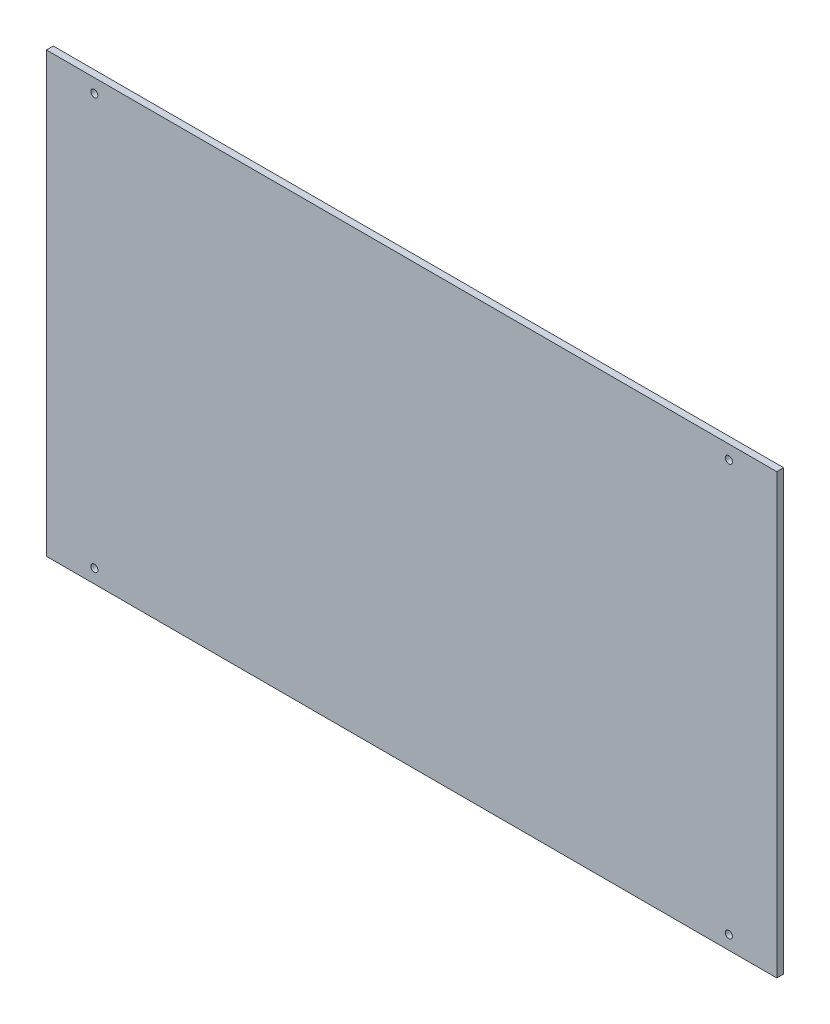
ISO-10303-21;
HEADER;
FILE_DESCRIPTION(('STEP AP214'),'2;1');
FILE_NAME('part.step','',(''),(''),'','','');
FILE_SCHEMA(('AUTOMOTIVE_DESIGN { 1 0 10303 214 1 1 1 1 }'));
ENDSEC;
DATA;
#1=APPLICATION_CONTEXT('core data for automotive mechanical design processes');
#2=APPLICATION_PROTOCOL_DEFINITION('international standard','automotive_design',2000,#1);
#3=PRODUCT_CONTEXT('',#1,'mechanical');
#4=PRODUCT('Part','Part','',(#3));
#5=PRODUCT_RELATED_PRODUCT_CATEGORY('part','',(#4));
#6=PRODUCT_DEFINITION_FORMATION('','',#4);
#7=PRODUCT_DEFINITION_CONTEXT('part definition',#1,'design');
#8=PRODUCT_DEFINITION('design','',#6,#7);
#9=PRODUCT_DEFINITION_SHAPE('','',#8);
#10=(LENGTH_UNIT() NAMED_UNIT(*) SI_UNIT(.MILLI.,.METRE.));
#11=(NAMED_UNIT(*) PLANE_ANGLE_UNIT() SI_UNIT($,.RADIAN.));
#12=(NAMED_UNIT(*) SI_UNIT($,.STERADIAN.) SOLID_ANGLE_UNIT());
#13=UNCERTAINTY_MEASURE_WITH_UNIT(LENGTH_MEASURE(1.E-05),#10,'distance_accuracy_value','');
#14=(GEOMETRIC_REPRESENTATION_CONTEXT(3) GLOBAL_UNCERTAINTY_ASSIGNED_CONTEXT((#13)) GLOBAL_UNIT_ASSIGNED_CONTEXT((#10,
#11,#12)) REPRESENTATION_CONTEXT('',''));
#15=CARTESIAN_POINT('',(0.,0.,0.));
#16=DIRECTION('',(0.,0.,1.));
#17=DIRECTION('',(1.,0.,0.));
#18=AXIS2_PLACEMENT_3D('',#15,#16,#17);
#19=CARTESIAN_POINT('',(0.,0.,5.));
#20=DIRECTION('',(0.,0.,-1.));
#21=DIRECTION('',(-1.,0.,0.));
#22=AXIS2_PLACEMENT_3D('',#19,#20,#21);
#23=PLANE('',#22);
#24=DIRECTION('',(1.,0.,0.));
#25=VECTOR('',#24,1.);
#26=CARTESIAN_POINT('',(533.,0.,5.));
#27=LINE('',#26,#25);
#28=CARTESIAN_POINT('',(0.,0.,5.));
#29=VERTEX_POINT('',#28);
#30=CARTESIAN_POINT('',(533.,0.,5.));
#31=VERTEX_POINT('',#30);
#32=EDGE_CURVE('E87',#29,#31,#27,.T.);
#33=ORIENTED_EDGE('',*,*,#32,.T.);
#34=DIRECTION('',(0.,1.,0.));
#35=VECTOR('',#34,1.);
#36=CARTESIAN_POINT('',(533.,320.,5.));
#37=LINE('',#36,#35);
#38=CARTESIAN_POINT('',(533.,320.,5.));
#39=VERTEX_POINT('',#38);
#40=EDGE_CURVE('E82',#31,#39,#37,.T.);
#41=ORIENTED_EDGE('',*,*,#40,.T.);
#42=DIRECTION('',(-1.,0.,0.));
#43=VECTOR('',#42,1.);
#44=CARTESIAN_POINT('',(0.,320.,5.));
#45=LINE('',#44,#43);
#46=CARTESIAN_POINT('',(0.,320.,5.));
#47=VERTEX_POINT('',#46);
#48=EDGE_CURVE('E85',#39,#47,#45,.T.);
#49=ORIENTED_EDGE('',*,*,#48,.T.);
#50=DIRECTION('',(0.,-1.,0.));
#51=VECTOR('',#50,1.);
#52=CARTESIAN_POINT('',(0.,0.,5.));
#53=LINE('',#52,#51);
#54=EDGE_CURVE('E52',#47,#29,#53,.T.);
#55=ORIENTED_EDGE('',*,*,#54,.T.);
#56=EDGE_LOOP('',(#33,#41,#49,#55));
#57=FACE_BOUND('',#56,.T.);
#58=CARTESIAN_POINT('',(35.,310.,5.));
#59=DIRECTION('',(0.,0.,1.));
#60=DIRECTION('',(1.,0.,0.));
#61=AXIS2_PLACEMENT_3D('',#58,#59,#60);
#62=CIRCLE('',#61,2.59999999999999);
#63=CARTESIAN_POINT('',(37.6,310.,5.));
#64=VERTEX_POINT('',#63);
#65=EDGE_CURVE('E102',#64,#64,#62,.T.);
#66=ORIENTED_EDGE('',*,*,#65,.F.);
#67=EDGE_LOOP('',(#66));
#68=FACE_BOUND('',#67,.T.);
#69=CARTESIAN_POINT('',(498.,310.,5.));
#70=DIRECTION('',(0.,0.,1.));
#71=DIRECTION('',(1.,0.,0.));
#72=AXIS2_PLACEMENT_3D('',#69,#70,#71);
#73=CIRCLE('',#72,2.60000000000007);
#74=CARTESIAN_POINT('',(500.6,310.,5.));
#75=VERTEX_POINT('',#74);
#76=EDGE_CURVE('E117',#75,#75,#73,.T.);
#77=ORIENTED_EDGE('',*,*,#76,.F.);
#78=EDGE_LOOP('',(#77));
#79=FACE_BOUND('',#78,.T.);
#80=CARTESIAN_POINT('',(498.000000000003,9.99999999999999,5.));
#81=DIRECTION('',(0.,0.,1.));
#82=DIRECTION('',(1.,0.,0.));
#83=AXIS2_PLACEMENT_3D('',#80,#81,#82);
#84=CIRCLE('',#83,2.60000000000002);
#85=CARTESIAN_POINT('',(500.600000000003,9.99999999999999,5.));
#86=VERTEX_POINT('',#85);
#87=EDGE_CURVE('E123',#86,#86,#84,.T.);
#88=ORIENTED_EDGE('',*,*,#87,.F.);
#89=EDGE_LOOP('',(#88));
#90=FACE_BOUND('',#89,.T.);
#91=CARTESIAN_POINT('',(35.0000000000031,10.,5.));
#92=DIRECTION('',(0.,0.,1.));
#93=DIRECTION('',(1.,0.,0.));
#94=AXIS2_PLACEMENT_3D('',#91,#92,#93);
#95=CIRCLE('',#94,2.6);
#96=CARTESIAN_POINT('',(37.6000000000031,10.,5.));
#97=VERTEX_POINT('',#96);
#98=EDGE_CURVE('E129',#97,#97,#95,.T.);
#99=ORIENTED_EDGE('',*,*,#98,.F.);
#100=EDGE_LOOP('',(#99));
#101=FACE_BOUND('',#100,.T.);
#102=ADVANCED_FACE('F35',(#57,#68,#79,#90,#101),#23,.F.);
#103=CARTESIAN_POINT('',(0.,0.,0.));
#104=DIRECTION('',(0.,0.,-1.));
#105=DIRECTION('',(-1.,0.,0.));
#106=AXIS2_PLACEMENT_3D('',#103,#104,#105);
#107=PLANE('',#106);
#108=CARTESIAN_POINT('',(498.000000000003,9.99999999999999,0.));
#109=DIRECTION('',(0.,0.,1.));
#110=DIRECTION('',(1.,0.,0.));
#111=AXIS2_PLACEMENT_3D('',#108,#109,#110);
#112=CIRCLE('',#111,2.60000000000002);
#113=CARTESIAN_POINT('',(500.600000000003,9.99999999999999,0.));
#114=VERTEX_POINT('',#113);
#115=EDGE_CURVE('E126',#114,#114,#112,.T.);
#116=ORIENTED_EDGE('',*,*,#115,.T.);
#117=EDGE_LOOP('',(#116));
#118=FACE_BOUND('',#117,.T.);
#119=CARTESIAN_POINT('',(35.,310.,0.));
#120=DIRECTION('',(0.,0.,1.));
#121=DIRECTION('',(1.,0.,0.));
#122=AXIS2_PLACEMENT_3D('',#119,#120,#121);
#123=CIRCLE('',#122,2.59999999999999);
#124=CARTESIAN_POINT('',(37.6,310.,0.));
#125=VERTEX_POINT('',#124);
#126=EDGE_CURVE('E114',#125,#125,#123,.T.);
#127=ORIENTED_EDGE('',*,*,#126,.T.);
#128=EDGE_LOOP('',(#127));
#129=FACE_BOUND('',#128,.T.);
#130=DIRECTION('',(1.,0.,0.));
#131=VECTOR('',#130,1.);
#132=CARTESIAN_POINT('',(533.,0.,0.));
#133=LINE('',#132,#131);
#134=CARTESIAN_POINT('',(0.,0.,0.));
#135=VERTEX_POINT('',#134);
#136=CARTESIAN_POINT('',(533.,0.,0.));
#137=VERTEX_POINT('',#136);
#138=EDGE_CURVE('E99',#135,#137,#133,.T.);
#139=ORIENTED_EDGE('',*,*,#138,.F.);
#140=DIRECTION('',(0.,-1.,0.));
#141=VECTOR('',#140,1.);
#142=CARTESIAN_POINT('',(0.,0.,0.));
#143=LINE('',#142,#141);
#144=CARTESIAN_POINT('',(0.,320.,0.));
#145=VERTEX_POINT('',#144);
#146=EDGE_CURVE('E75',#145,#135,#143,.T.);
#147=ORIENTED_EDGE('',*,*,#146,.F.);
#148=DIRECTION('',(-1.,0.,0.));
#149=VECTOR('',#148,1.);
#150=CARTESIAN_POINT('',(0.,320.,0.));
#151=LINE('',#150,#149);
#152=CARTESIAN_POINT('',(533.,320.,0.));
#153=VERTEX_POINT('',#152);
#154=EDGE_CURVE('E69',#153,#145,#151,.T.);
#155=ORIENTED_EDGE('',*,*,#154,.F.);
#156=DIRECTION('',(0.,1.,0.));
#157=VECTOR('',#156,1.);
#158=CARTESIAN_POINT('',(533.,320.,0.));
#159=LINE('',#158,#157);
#160=EDGE_CURVE('E91',#137,#153,#159,.T.);
#161=ORIENTED_EDGE('',*,*,#160,.F.);
#162=EDGE_LOOP('',(#139,#147,#155,#161));
#163=FACE_BOUND('',#162,.T.);
#164=CARTESIAN_POINT('',(498.,310.,0.));
#165=DIRECTION('',(0.,0.,1.));
#166=DIRECTION('',(1.,0.,0.));
#167=AXIS2_PLACEMENT_3D('',#164,#165,#166);
#168=CIRCLE('',#167,2.60000000000007);
#169=CARTESIAN_POINT('',(500.6,310.,0.));
#170=VERTEX_POINT('',#169);
#171=EDGE_CURVE('E120',#170,#170,#168,.T.);
#172=ORIENTED_EDGE('',*,*,#171,.T.);
#173=EDGE_LOOP('',(#172));
#174=FACE_BOUND('',#173,.T.);
#175=CARTESIAN_POINT('',(35.0000000000031,10.,0.));
#176=DIRECTION('',(0.,0.,1.));
#177=DIRECTION('',(1.,0.,0.));
#178=AXIS2_PLACEMENT_3D('',#175,#176,#177);
#179=CIRCLE('',#178,2.6);
#180=CARTESIAN_POINT('',(37.6000000000031,10.,0.));
#181=VERTEX_POINT('',#180);
#182=EDGE_CURVE('E132',#181,#181,#179,.T.);
#183=ORIENTED_EDGE('',*,*,#182,.T.);
#184=EDGE_LOOP('',(#183));
#185=FACE_BOUND('',#184,.T.);
#186=ADVANCED_FACE('F110',(#118,#129,#163,#174,#185),#107,.T.);
#187=CARTESIAN_POINT('',(533.,0.,5.));
#188=DIRECTION('',(0.,1.,0.));
#189=DIRECTION('',(0.,0.,1.));
#190=AXIS2_PLACEMENT_3D('',#187,#188,#189);
#191=PLANE('',#190);
#192=ORIENTED_EDGE('',*,*,#138,.T.);
#193=DIRECTION('',(0.,0.,-1.));
#194=VECTOR('',#193,1.);
#195=CARTESIAN_POINT('',(533.,0.,5.));
#196=LINE('',#195,#194);
#197=EDGE_CURVE('E11',#31,#137,#196,.T.);
#198=ORIENTED_EDGE('',*,*,#197,.F.);
#199=ORIENTED_EDGE('',*,*,#32,.F.);
#200=DIRECTION('',(0.,0.,-1.));
#201=VECTOR('',#200,1.);
#202=CARTESIAN_POINT('',(0.,0.,5.));
#203=LINE('',#202,#201);
#204=EDGE_CURVE('E95',#29,#135,#203,.T.);
#205=ORIENTED_EDGE('',*,*,#204,.T.);
#206=EDGE_LOOP('',(#192,#198,#199,#205));
#207=FACE_BOUND('',#206,.T.);
#208=ADVANCED_FACE('F37',(#207),#191,.F.);
#209=CARTESIAN_POINT('',(533.,320.,5.));
#210=DIRECTION('',(-1.,0.,0.));
#211=DIRECTION('',(0.,0.,1.));
#212=AXIS2_PLACEMENT_3D('',#209,#210,#211);
#213=PLANE('',#212);
#214=ORIENTED_EDGE('',*,*,#160,.T.);
#215=DIRECTION('',(0.,0.,-1.));
#216=VECTOR('',#215,1.);
#217=CARTESIAN_POINT('',(533.,320.,5.));
#218=LINE('',#217,#216);
#219=EDGE_CURVE('E44',#39,#153,#218,.T.);
#220=ORIENTED_EDGE('',*,*,#219,.F.);
#221=ORIENTED_EDGE('',*,*,#40,.F.);
#222=ORIENTED_EDGE('',*,*,#197,.T.);
#223=EDGE_LOOP('',(#214,#220,#221,#222));
#224=FACE_BOUND('',#223,.T.);
#225=ADVANCED_FACE('F90',(#224),#213,.F.);
#226=CARTESIAN_POINT('',(0.,320.,5.));
#227=DIRECTION('',(0.,-1.,0.));
#228=DIRECTION('',(0.,0.,-1.));
#229=AXIS2_PLACEMENT_3D('',#226,#227,#228);
#230=PLANE('',#229);
#231=ORIENTED_EDGE('',*,*,#154,.T.);
#232=DIRECTION('',(0.,0.,-1.));
#233=VECTOR('',#232,1.);
#234=CARTESIAN_POINT('',(0.,320.,5.));
#235=LINE('',#234,#233);
#236=EDGE_CURVE('E92',#47,#145,#235,.T.);
#237=ORIENTED_EDGE('',*,*,#236,.F.);
#238=ORIENTED_EDGE('',*,*,#48,.F.);
#239=ORIENTED_EDGE('',*,*,#219,.T.);
#240=EDGE_LOOP('',(#231,#237,#238,#239));
#241=FACE_BOUND('',#240,.T.);
#242=ADVANCED_FACE('F93',(#241),#230,.F.);
#243=CARTESIAN_POINT('',(0.,0.,5.));
#244=DIRECTION('',(1.,0.,0.));
#245=DIRECTION('',(0.,0.,-1.));
#246=AXIS2_PLACEMENT_3D('',#243,#244,#245);
#247=PLANE('',#246);
#248=ORIENTED_EDGE('',*,*,#146,.T.);
#249=ORIENTED_EDGE('',*,*,#204,.F.);
#250=ORIENTED_EDGE('',*,*,#54,.F.);
#251=ORIENTED_EDGE('',*,*,#236,.T.);
#252=EDGE_LOOP('',(#248,#249,#250,#251));
#253=FACE_BOUND('',#252,.T.);
#254=ADVANCED_FACE('F107',(#253),#247,.F.);
#255=CARTESIAN_POINT('',(35.,310.,5.));
#256=DIRECTION('',(0.,0.,-1.));
#257=DIRECTION('',(-1.,0.,0.));
#258=AXIS2_PLACEMENT_3D('',#255,#256,#257);
#259=CYLINDRICAL_SURFACE('',#258,2.59999999999999);
#260=ORIENTED_EDGE('',*,*,#65,.T.);
#261=EDGE_LOOP('',(#260));
#262=FACE_BOUND('',#261,.T.);
#263=ORIENTED_EDGE('',*,*,#126,.F.);
#264=EDGE_LOOP('',(#263));
#265=FACE_BOUND('',#264,.T.);
#266=ADVANCED_FACE('F149',(#262,#265),#259,.F.);
#267=CARTESIAN_POINT('',(498.,310.,5.));
#268=DIRECTION('',(0.,0.,-1.));
#269=DIRECTION('',(-1.,0.,0.));
#270=AXIS2_PLACEMENT_3D('',#267,#268,#269);
#271=CYLINDRICAL_SURFACE('',#270,2.60000000000007);
#272=ORIENTED_EDGE('',*,*,#76,.T.);
#273=EDGE_LOOP('',(#272));
#274=FACE_BOUND('',#273,.T.);
#275=ORIENTED_EDGE('',*,*,#171,.F.);
#276=EDGE_LOOP('',(#275));
#277=FACE_BOUND('',#276,.T.);
#278=ADVANCED_FACE('F195',(#274,#277),#271,.F.);
#279=CARTESIAN_POINT('',(498.000000000003,9.99999999999999,5.));
#280=DIRECTION('',(0.,0.,-1.));
#281=DIRECTION('',(-1.,0.,0.));
#282=AXIS2_PLACEMENT_3D('',#279,#280,#281);
#283=CYLINDRICAL_SURFACE('',#282,2.60000000000002);
#284=ORIENTED_EDGE('',*,*,#87,.T.);
#285=EDGE_LOOP('',(#284));
#286=FACE_BOUND('',#285,.T.);
#287=ORIENTED_EDGE('',*,*,#115,.F.);
#288=EDGE_LOOP('',(#287));
#289=FACE_BOUND('',#288,.T.);
#290=ADVANCED_FACE('F203',(#286,#289),#283,.F.);
#291=CARTESIAN_POINT('',(35.0000000000031,10.,5.));
#292=DIRECTION('',(0.,0.,-1.));
#293=DIRECTION('',(-1.,0.,0.));
#294=AXIS2_PLACEMENT_3D('',#291,#292,#293);
#295=CYLINDRICAL_SURFACE('',#294,2.6);
#296=ORIENTED_EDGE('',*,*,#98,.T.);
#297=EDGE_LOOP('',(#296));
#298=FACE_BOUND('',#297,.T.);
#299=ORIENTED_EDGE('',*,*,#182,.F.);
#300=EDGE_LOOP('',(#299));
#301=FACE_BOUND('',#300,.T.);
#302=ADVANCED_FACE('F138',(#298,#301),#295,.F.);
#303=CLOSED_SHELL('',(#102,#186,#208,#225,#242,#254,#266,#278,#290,#302));
#304=MANIFOLD_SOLID_BREP('B2',#303);
#305=ADVANCED_BREP_SHAPE_REPRESENTATION('',(#18,#304),#14);
#306=SHAPE_DEFINITION_REPRESENTATION(#9,#305);
ENDSEC;
END-ISO-10303-21;
